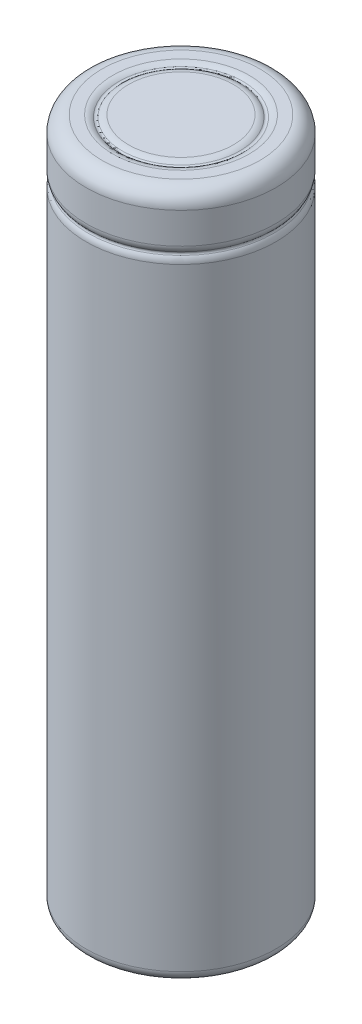
ISO-10303-21;
HEADER;
FILE_DESCRIPTION(('STEP AP214'),'2;1');
FILE_NAME('part.step','',(''),(''),'','','');
FILE_SCHEMA(('AUTOMOTIVE_DESIGN { 1 0 10303 214 1 1 1 1 }'));
ENDSEC;
DATA;
#1=APPLICATION_CONTEXT('core data for automotive mechanical design processes');
#2=APPLICATION_PROTOCOL_DEFINITION('international standard','automotive_design',2000,#1);
#3=PRODUCT_CONTEXT('',#1,'mechanical');
#4=PRODUCT('Part','Part','',(#3));
#5=PRODUCT_RELATED_PRODUCT_CATEGORY('part','',(#4));
#6=PRODUCT_DEFINITION_FORMATION('','',#4);
#7=PRODUCT_DEFINITION_CONTEXT('part definition',#1,'design');
#8=PRODUCT_DEFINITION('design','',#6,#7);
#9=PRODUCT_DEFINITION_SHAPE('','',#8);
#10=(LENGTH_UNIT() NAMED_UNIT(*) SI_UNIT(.MILLI.,.METRE.));
#11=(NAMED_UNIT(*) PLANE_ANGLE_UNIT() SI_UNIT($,.RADIAN.));
#12=(NAMED_UNIT(*) SI_UNIT($,.STERADIAN.) SOLID_ANGLE_UNIT());
#13=UNCERTAINTY_MEASURE_WITH_UNIT(LENGTH_MEASURE(1.E-05),#10,'distance_accuracy_value','');
#14=(GEOMETRIC_REPRESENTATION_CONTEXT(3) GLOBAL_UNCERTAINTY_ASSIGNED_CONTEXT((#13)) GLOBAL_UNIT_ASSIGNED_CONTEXT((#10,
#11,#12)) REPRESENTATION_CONTEXT('',''));
#15=CARTESIAN_POINT('',(0.,0.,0.));
#16=DIRECTION('',(0.,0.,1.));
#17=DIRECTION('',(1.,0.,0.));
#18=AXIS2_PLACEMENT_3D('',#15,#16,#17);
#19=CARTESIAN_POINT('',(0.,65.,0.));
#20=DIRECTION('',(0.,1.,0.));
#21=DIRECTION('',(-1.,0.,0.));
#22=AXIS2_PLACEMENT_3D('',#19,#20,#21);
#23=TOROIDAL_SURFACE('',#22,5.71829199091667,0.25);
#24=CARTESIAN_POINT('',(0.,64.8,0.));
#25=DIRECTION('',(0.,1.,0.));
#26=DIRECTION('',(-1.,0.,0.));
#27=AXIS2_PLACEMENT_3D('',#24,#25,#26);
#28=CIRCLE('',#27,5.86829199091671);
#29=CARTESIAN_POINT('',(-5.86829199091672,64.8,0.));
#30=VERTEX_POINT('',#29);
#31=EDGE_CURVE('E43',#30,#30,#28,.T.);
#32=ORIENTED_EDGE('',*,*,#31,.T.);
#33=EDGE_LOOP('',(#32));
#34=FACE_BOUND('',#33,.T.);
#35=CARTESIAN_POINT('',(0.,64.8,0.));
#36=DIRECTION('',(0.,1.,0.));
#37=DIRECTION('',(-1.,0.,0.));
#38=AXIS2_PLACEMENT_3D('',#35,#36,#37);
#39=CIRCLE('',#38,5.56829199091666);
#40=CARTESIAN_POINT('',(-5.56829199091666,64.8,0.));
#41=VERTEX_POINT('',#40);
#42=EDGE_CURVE('E47',#41,#41,#39,.F.);
#43=ORIENTED_EDGE('',*,*,#42,.T.);
#44=EDGE_LOOP('',(#43));
#45=FACE_BOUND('',#44,.T.);
#46=ADVANCED_FACE('F36',(#34,#45),#23,.F.);
#47=CARTESIAN_POINT('',(0.,65.,0.));
#48=DIRECTION('',(0.,-1.,0.));
#49=DIRECTION('',(1.,0.,0.));
#50=AXIS2_PLACEMENT_3D('',#47,#48,#49);
#51=PLANE('',#50);
#52=CARTESIAN_POINT('',(0.,65.,0.));
#53=DIRECTION('',(0.,-1.,0.));
#54=DIRECTION('',(1.,0.,0.));
#55=AXIS2_PLACEMENT_3D('',#52,#53,#54);
#56=CIRCLE('',#55,4.96829199091667);
#57=CARTESIAN_POINT('',(4.96829199091667,65.,0.));
#58=VERTEX_POINT('',#57);
#59=EDGE_CURVE('E51',#58,#58,#56,.F.);
#60=ORIENTED_EDGE('',*,*,#59,.T.);
#61=EDGE_LOOP('',(#60));
#62=FACE_BOUND('',#61,.T.);
#63=ADVANCED_FACE('F101',(#62),#51,.F.);
#64=CARTESIAN_POINT('',(0.,0.,0.));
#65=DIRECTION('',(0.,1.,0.));
#66=DIRECTION('',(-1.,0.,0.));
#67=AXIS2_PLACEMENT_3D('',#64,#65,#66);
#68=PLANE('',#67);
#69=CARTESIAN_POINT('',(0.,0.,0.));
#70=DIRECTION('',(0.,1.,0.));
#71=DIRECTION('',(-1.,0.,0.));
#72=AXIS2_PLACEMENT_3D('',#69,#70,#71);
#73=CIRCLE('',#72,8.);
#74=CARTESIAN_POINT('',(-8.,0.,0.));
#75=VERTEX_POINT('',#74);
#76=EDGE_CURVE('E74',#75,#75,#73,.F.);
#77=ORIENTED_EDGE('',*,*,#76,.T.);
#78=EDGE_LOOP('',(#77));
#79=FACE_BOUND('',#78,.T.);
#80=ADVANCED_FACE('F105',(#79),#68,.F.);
#81=CARTESIAN_POINT('',(0.,65.,0.));
#82=DIRECTION('',(0.,1.,0.));
#83=DIRECTION('',(-1.,0.,0.));
#84=AXIS2_PLACEMENT_3D('',#81,#82,#83);
#85=CYLINDRICAL_SURFACE('',#84,9.);
#86=CARTESIAN_POINT('',(0.,59.0556869920924,0.));
#87=DIRECTION('',(0.,-1.,0.));
#88=DIRECTION('',(1.,0.,0.));
#89=AXIS2_PLACEMENT_3D('',#86,#87,#88);
#90=CIRCLE('',#89,9.);
#91=CARTESIAN_POINT('',(9.,59.0556869920924,0.));
#92=VERTEX_POINT('',#91);
#93=EDGE_CURVE('E62',#92,#92,#90,.T.);
#94=ORIENTED_EDGE('',*,*,#93,.T.);
#95=EDGE_LOOP('',(#94));
#96=FACE_BOUND('',#95,.T.);
#97=CARTESIAN_POINT('',(0.,1.,0.));
#98=DIRECTION('',(0.,1.,0.));
#99=DIRECTION('',(-1.,0.,0.));
#100=AXIS2_PLACEMENT_3D('',#97,#98,#99);
#101=CIRCLE('',#100,9.);
#102=CARTESIAN_POINT('',(-9.,1.,0.));
#103=VERTEX_POINT('',#102);
#104=EDGE_CURVE('E77',#103,#103,#101,.T.);
#105=ORIENTED_EDGE('',*,*,#104,.T.);
#106=EDGE_LOOP('',(#105));
#107=FACE_BOUND('',#106,.T.);
#108=ADVANCED_FACE('F81',(#96,#107),#85,.T.);
#109=CARTESIAN_POINT('',(0.,59.8056869920924,0.));
#110=DIRECTION('',(0.,1.,0.));
#111=DIRECTION('',(-1.,0.,0.));
#112=AXIS2_PLACEMENT_3D('',#109,#110,#111);
#113=TOROIDAL_SURFACE('',#112,9.00000000000001,0.25);
#114=CARTESIAN_POINT('',(0.,59.9556869920924,0.));
#115=DIRECTION('',(0.,-1.,0.));
#116=DIRECTION('',(1.,0.,0.));
#117=AXIS2_PLACEMENT_3D('',#114,#115,#116);
#118=CIRCLE('',#117,8.80000000000005);
#119=CARTESIAN_POINT('',(8.80000000000005,59.9556869920924,0.));
#120=VERTEX_POINT('',#119);
#121=EDGE_CURVE('E56',#120,#120,#118,.T.);
#122=ORIENTED_EDGE('',*,*,#121,.T.);
#123=EDGE_LOOP('',(#122));
#124=FACE_BOUND('',#123,.T.);
#125=CARTESIAN_POINT('',(0.,59.6556869920924,0.));
#126=DIRECTION('',(0.,1.,0.));
#127=DIRECTION('',(-1.,0.,0.));
#128=AXIS2_PLACEMENT_3D('',#125,#126,#127);
#129=CIRCLE('',#128,8.79999999999999);
#130=CARTESIAN_POINT('',(-8.8,59.6556869920924,0.));
#131=VERTEX_POINT('',#130);
#132=EDGE_CURVE('E65',#131,#131,#129,.T.);
#133=ORIENTED_EDGE('',*,*,#132,.T.);
#134=EDGE_LOOP('',(#133));
#135=FACE_BOUND('',#134,.T.);
#136=ADVANCED_FACE('F113',(#124,#135),#113,.F.);
#137=CARTESIAN_POINT('',(0.,60.5556869920925,0.));
#138=DIRECTION('',(0.,-1.,0.));
#139=DIRECTION('',(1.,0.,0.));
#140=AXIS2_PLACEMENT_3D('',#137,#138,#139);
#141=CIRCLE('',#140,9.);
#142=CARTESIAN_POINT('',(9.,60.5556869920925,0.));
#143=VERTEX_POINT('',#142);
#144=EDGE_CURVE('E59',#143,#143,#141,.F.);
#145=ORIENTED_EDGE('',*,*,#144,.T.);
#146=EDGE_LOOP('',(#145));
#147=FACE_BOUND('',#146,.T.);
#148=CARTESIAN_POINT('',(0.,63.5,0.));
#149=DIRECTION('',(0.,-1.,0.));
#150=DIRECTION('',(1.,0.,0.));
#151=AXIS2_PLACEMENT_3D('',#148,#149,#150);
#152=CIRCLE('',#151,9.);
#153=CARTESIAN_POINT('',(9.,63.5,0.));
#154=VERTEX_POINT('',#153);
#155=EDGE_CURVE('E68',#154,#154,#152,.T.);
#156=ORIENTED_EDGE('',*,*,#155,.T.);
#157=EDGE_LOOP('',(#156));
#158=FACE_BOUND('',#157,.T.);
#159=ADVANCED_FACE('F96',(#147,#158),#85,.T.);
#160=CARTESIAN_POINT('',(0.,65.,0.));
#161=DIRECTION('',(0.,-1.,0.));
#162=DIRECTION('',(1.,0.,0.));
#163=AXIS2_PLACEMENT_3D('',#160,#161,#162);
#164=PLANE('',#163);
#165=CARTESIAN_POINT('',(0.,65.,0.));
#166=DIRECTION('',(0.,-1.,0.));
#167=DIRECTION('',(1.,0.,0.));
#168=AXIS2_PLACEMENT_3D('',#165,#166,#167);
#169=CIRCLE('',#168,6.46829199091667);
#170=CARTESIAN_POINT('',(6.46829199091667,65.,0.));
#171=VERTEX_POINT('',#170);
#172=EDGE_CURVE('E10',#171,#171,#169,.T.);
#173=ORIENTED_EDGE('',*,*,#172,.T.);
#174=EDGE_LOOP('',(#173));
#175=FACE_BOUND('',#174,.T.);
#176=CARTESIAN_POINT('',(0.,65.,0.));
#177=DIRECTION('',(0.,-1.,0.));
#178=DIRECTION('',(1.,0.,0.));
#179=AXIS2_PLACEMENT_3D('',#176,#177,#178);
#180=CIRCLE('',#179,7.5);
#181=CARTESIAN_POINT('',(7.5,65.,0.));
#182=VERTEX_POINT('',#181);
#183=EDGE_CURVE('E71',#182,#182,#180,.F.);
#184=ORIENTED_EDGE('',*,*,#183,.T.);
#185=EDGE_LOOP('',(#184));
#186=FACE_BOUND('',#185,.T.);
#187=ADVANCED_FACE('F86',(#175,#186),#164,.F.);
#188=CARTESIAN_POINT('',(0.,1.,0.));
#189=DIRECTION('',(0.,1.,0.));
#190=DIRECTION('',(-1.,0.,0.));
#191=AXIS2_PLACEMENT_3D('',#188,#189,#190);
#192=TOROIDAL_SURFACE('',#191,8.,1.);
#193=ORIENTED_EDGE('',*,*,#76,.F.);
#194=EDGE_LOOP('',(#193));
#195=FACE_BOUND('',#194,.T.);
#196=ORIENTED_EDGE('',*,*,#104,.F.);
#197=EDGE_LOOP('',(#196));
#198=FACE_BOUND('',#197,.T.);
#199=ADVANCED_FACE('F83',(#195,#198),#192,.T.);
#200=CARTESIAN_POINT('',(0.,63.5,0.));
#201=DIRECTION('',(0.,-1.,0.));
#202=DIRECTION('',(1.,0.,0.));
#203=AXIS2_PLACEMENT_3D('',#200,#201,#202);
#204=TOROIDAL_SURFACE('',#203,7.5,1.5);
#205=ORIENTED_EDGE('',*,*,#155,.F.);
#206=EDGE_LOOP('',(#205));
#207=FACE_BOUND('',#206,.T.);
#208=ORIENTED_EDGE('',*,*,#183,.F.);
#209=EDGE_LOOP('',(#208));
#210=FACE_BOUND('',#209,.T.);
#211=ADVANCED_FACE('F85',(#207,#210),#204,.T.);
#212=CARTESIAN_POINT('',(0.,59.0556869920924,0.));
#213=DIRECTION('',(0.,-1.,0.));
#214=DIRECTION('',(1.,0.,0.));
#215=AXIS2_PLACEMENT_3D('',#212,#213,#214);
#216=TOROIDAL_SURFACE('',#215,8.00000000000002,1.);
#217=ORIENTED_EDGE('',*,*,#93,.F.);
#218=EDGE_LOOP('',(#217));
#219=FACE_BOUND('',#218,.T.);
#220=ORIENTED_EDGE('',*,*,#132,.F.);
#221=EDGE_LOOP('',(#220));
#222=FACE_BOUND('',#221,.T.);
#223=ADVANCED_FACE('F93',(#219,#222),#216,.T.);
#224=CARTESIAN_POINT('',(0.,60.5556869920925,0.));
#225=DIRECTION('',(0.,-1.,0.));
#226=DIRECTION('',(1.,0.,0.));
#227=AXIS2_PLACEMENT_3D('',#224,#225,#226);
#228=TOROIDAL_SURFACE('',#227,8.00000000000001,1.);
#229=ORIENTED_EDGE('',*,*,#121,.F.);
#230=EDGE_LOOP('',(#229));
#231=FACE_BOUND('',#230,.T.);
#232=ORIENTED_EDGE('',*,*,#144,.F.);
#233=EDGE_LOOP('',(#232));
#234=FACE_BOUND('',#233,.T.);
#235=ADVANCED_FACE('F130',(#231,#234),#228,.T.);
#236=CARTESIAN_POINT('',(0.,64.,0.));
#237=DIRECTION('',(0.,1.,0.));
#238=DIRECTION('',(-1.,0.,0.));
#239=AXIS2_PLACEMENT_3D('',#236,#237,#238);
#240=TOROIDAL_SURFACE('',#239,4.96829199091667,1.);
#241=ORIENTED_EDGE('',*,*,#42,.F.);
#242=EDGE_LOOP('',(#241));
#243=FACE_BOUND('',#242,.T.);
#244=ORIENTED_EDGE('',*,*,#59,.F.);
#245=EDGE_LOOP('',(#244));
#246=FACE_BOUND('',#245,.T.);
#247=ADVANCED_FACE('F137',(#243,#246),#240,.T.);
#248=CARTESIAN_POINT('',(0.,64.,0.));
#249=DIRECTION('',(0.,-1.,0.));
#250=DIRECTION('',(1.,0.,0.));
#251=AXIS2_PLACEMENT_3D('',#248,#249,#250);
#252=TOROIDAL_SURFACE('',#251,6.46829199091667,1.);
#253=ORIENTED_EDGE('',*,*,#172,.F.);
#254=EDGE_LOOP('',(#253));
#255=FACE_BOUND('',#254,.T.);
#256=ORIENTED_EDGE('',*,*,#31,.F.);
#257=EDGE_LOOP('',(#256));
#258=FACE_BOUND('',#257,.T.);
#259=ADVANCED_FACE('F38',(#255,#258),#252,.T.);
#260=CLOSED_SHELL('',(#46,#63,#80,#108,#136,#159,#187,#199,#211,#223,#235,#247,#259));
#261=MANIFOLD_SOLID_BREP('B2',#260);
#262=ADVANCED_BREP_SHAPE_REPRESENTATION('',(#18,#261),#14);
#263=SHAPE_DEFINITION_REPRESENTATION(#9,#262);
ENDSEC;
END-ISO-10303-21;
